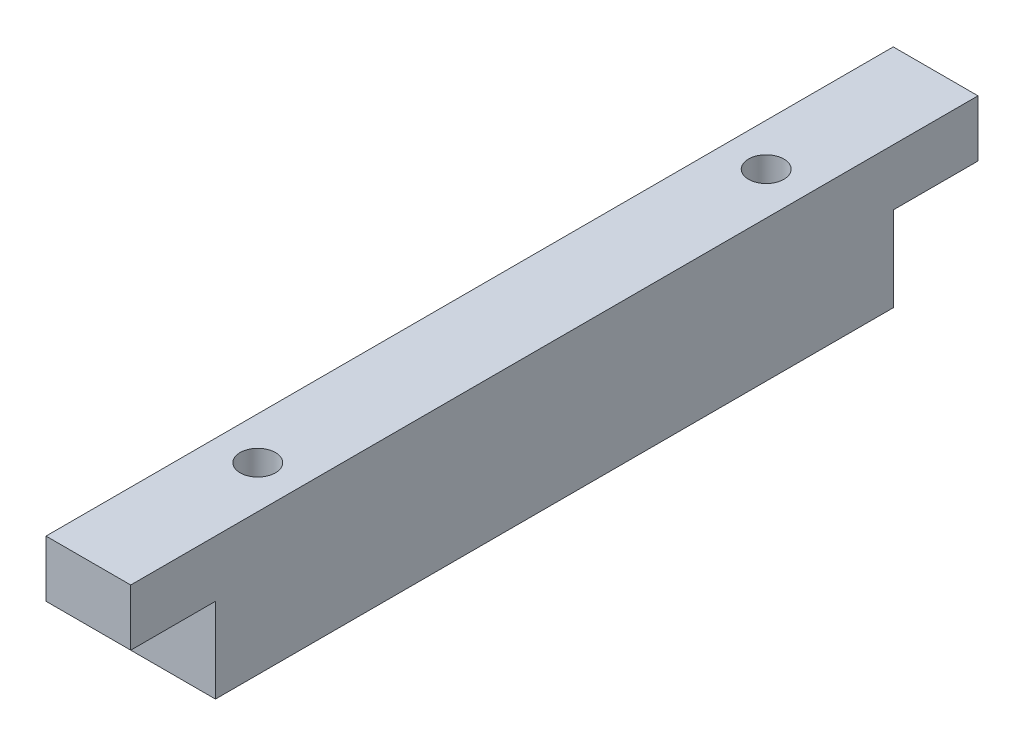
ISO-10303-21;
HEADER;
FILE_DESCRIPTION(('STEP AP214'),'2;1');
FILE_NAME('part.step','',(''),(''),'','','');
FILE_SCHEMA(('AUTOMOTIVE_DESIGN { 1 0 10303 214 1 1 1 1 }'));
ENDSEC;
DATA;
#1=APPLICATION_CONTEXT('core data for automotive mechanical design processes');
#2=APPLICATION_PROTOCOL_DEFINITION('international standard','automotive_design',2000,#1);
#3=PRODUCT_CONTEXT('',#1,'mechanical');
#4=PRODUCT('Part','Part','',(#3));
#5=PRODUCT_RELATED_PRODUCT_CATEGORY('part','',(#4));
#6=PRODUCT_DEFINITION_FORMATION('','',#4);
#7=PRODUCT_DEFINITION_CONTEXT('part definition',#1,'design');
#8=PRODUCT_DEFINITION('design','',#6,#7);
#9=PRODUCT_DEFINITION_SHAPE('','',#8);
#10=(LENGTH_UNIT() NAMED_UNIT(*) SI_UNIT(.MILLI.,.METRE.));
#11=(NAMED_UNIT(*) PLANE_ANGLE_UNIT() SI_UNIT($,.RADIAN.));
#12=(NAMED_UNIT(*) SI_UNIT($,.STERADIAN.) SOLID_ANGLE_UNIT());
#13=UNCERTAINTY_MEASURE_WITH_UNIT(LENGTH_MEASURE(1.E-05),#10,'distance_accuracy_value','');
#14=(GEOMETRIC_REPRESENTATION_CONTEXT(3) GLOBAL_UNCERTAINTY_ASSIGNED_CONTEXT((#13)) GLOBAL_UNIT_ASSIGNED_CONTEXT((#10,
#11,#12)) REPRESENTATION_CONTEXT('',''));
#15=CARTESIAN_POINT('',(0.,0.,0.));
#16=DIRECTION('',(0.,0.,1.));
#17=DIRECTION('',(1.,0.,0.));
#18=AXIS2_PLACEMENT_3D('',#15,#16,#17);
#19=CARTESIAN_POINT('',(6.,5.99999999999999,-6.));
#20=DIRECTION('',(0.,1.,0.));
#21=DIRECTION('',(0.,0.,1.));
#22=AXIS2_PLACEMENT_3D('',#19,#20,#21);
#23=PLANE('',#22);
#24=DIRECTION('',(0.,0.,-1.));
#25=VECTOR('',#24,1.);
#26=CARTESIAN_POINT('',(0.,5.99999999999999,-6.));
#27=LINE('',#26,#25);
#28=CARTESIAN_POINT('',(0.,5.99999999999999,0.));
#29=VERTEX_POINT('',#28);
#30=CARTESIAN_POINT('',(0.,5.99999999999999,-6.));
#31=VERTEX_POINT('',#30);
#32=EDGE_CURVE('E129',#29,#31,#27,.T.);
#33=ORIENTED_EDGE('',*,*,#32,.T.);
#34=DIRECTION('',(-1.,0.,0.));
#35=VECTOR('',#34,1.);
#36=CARTESIAN_POINT('',(6.,5.99999999999999,-6.));
#37=LINE('',#36,#35);
#38=CARTESIAN_POINT('',(6.,5.99999999999999,-6.));
#39=VERTEX_POINT('',#38);
#40=EDGE_CURVE('E11',#39,#31,#37,.T.);
#41=ORIENTED_EDGE('',*,*,#40,.F.);
#42=DIRECTION('',(0.,0.,-1.));
#43=VECTOR('',#42,1.);
#44=CARTESIAN_POINT('',(6.,5.99999999999999,-6.));
#45=LINE('',#44,#43);
#46=CARTESIAN_POINT('',(6.,5.99999999999999,0.));
#47=VERTEX_POINT('',#46);
#48=EDGE_CURVE('E144',#47,#39,#45,.T.);
#49=ORIENTED_EDGE('',*,*,#48,.F.);
#50=DIRECTION('',(-1.,0.,0.));
#51=VECTOR('',#50,1.);
#52=CARTESIAN_POINT('',(6.,5.99999999999999,0.));
#53=LINE('',#52,#51);
#54=EDGE_CURVE('E125',#47,#29,#53,.T.);
#55=ORIENTED_EDGE('',*,*,#54,.T.);
#56=EDGE_LOOP('',(#33,#41,#49,#55));
#57=FACE_BOUND('',#56,.T.);
#58=ADVANCED_FACE('F33',(#57),#23,.F.);
#59=CARTESIAN_POINT('',(6.,0.,-6.));
#60=DIRECTION('',(0.,0.,-1.));
#61=DIRECTION('',(-1.,0.,0.));
#62=AXIS2_PLACEMENT_3D('',#59,#60,#61);
#63=PLANE('',#62);
#64=DIRECTION('',(0.,-1.,0.));
#65=VECTOR('',#64,1.);
#66=CARTESIAN_POINT('',(0.,0.,-6.));
#67=LINE('',#66,#65);
#68=CARTESIAN_POINT('',(0.,0.,-6.));
#69=VERTEX_POINT('',#68);
#70=EDGE_CURVE('E132',#31,#69,#67,.T.);
#71=ORIENTED_EDGE('',*,*,#70,.T.);
#72=DIRECTION('',(-1.,0.,0.));
#73=VECTOR('',#72,1.);
#74=CARTESIAN_POINT('',(6.,0.,-6.));
#75=LINE('',#74,#73);
#76=CARTESIAN_POINT('',(6.,0.,-6.));
#77=VERTEX_POINT('',#76);
#78=EDGE_CURVE('E41',#77,#69,#75,.T.);
#79=ORIENTED_EDGE('',*,*,#78,.F.);
#80=DIRECTION('',(0.,-1.,0.));
#81=VECTOR('',#80,1.);
#82=CARTESIAN_POINT('',(6.,0.,-6.));
#83=LINE('',#82,#81);
#84=EDGE_CURVE('E92',#39,#77,#83,.T.);
#85=ORIENTED_EDGE('',*,*,#84,.F.);
#86=ORIENTED_EDGE('',*,*,#40,.T.);
#87=EDGE_LOOP('',(#71,#79,#85,#86));
#88=FACE_BOUND('',#87,.T.);
#89=ADVANCED_FACE('F193',(#88),#63,.F.);
#90=CARTESIAN_POINT('',(6.,0.,-54.));
#91=DIRECTION('',(0.,1.,0.));
#92=DIRECTION('',(0.,0.,1.));
#93=AXIS2_PLACEMENT_3D('',#90,#91,#92);
#94=PLANE('',#93);
#95=CARTESIAN_POINT('',(3.,0.,-12.));
#96=DIRECTION('',(0.,-1.,0.));
#97=DIRECTION('',(0.,0.,-1.));
#98=AXIS2_PLACEMENT_3D('',#95,#96,#97);
#99=CIRCLE('',#98,1.24999999999999);
#100=CARTESIAN_POINT('',(3.,0.,-13.25));
#101=VERTEX_POINT('',#100);
#102=EDGE_CURVE('E185',#101,#101,#99,.T.);
#103=ORIENTED_EDGE('',*,*,#102,.F.);
#104=EDGE_LOOP('',(#103));
#105=FACE_BOUND('',#104,.T.);
#106=CARTESIAN_POINT('',(3.,0.,-48.));
#107=DIRECTION('',(0.,-1.,0.));
#108=DIRECTION('',(0.,0.,-1.));
#109=AXIS2_PLACEMENT_3D('',#106,#107,#108);
#110=CIRCLE('',#109,1.24999999999999);
#111=CARTESIAN_POINT('',(3.,0.,-49.25));
#112=VERTEX_POINT('',#111);
#113=EDGE_CURVE('E179',#112,#112,#110,.T.);
#114=ORIENTED_EDGE('',*,*,#113,.F.);
#115=EDGE_LOOP('',(#114));
#116=FACE_BOUND('',#115,.T.);
#117=DIRECTION('',(0.,0.,-1.));
#118=VECTOR('',#117,1.);
#119=CARTESIAN_POINT('',(0.,0.,-54.));
#120=LINE('',#119,#118);
#121=CARTESIAN_POINT('',(0.,0.,-54.));
#122=VERTEX_POINT('',#121);
#123=EDGE_CURVE('E135',#69,#122,#120,.T.);
#124=ORIENTED_EDGE('',*,*,#123,.T.);
#125=DIRECTION('',(-1.,0.,0.));
#126=VECTOR('',#125,1.);
#127=CARTESIAN_POINT('',(6.,0.,-54.));
#128=LINE('',#127,#126);
#129=CARTESIAN_POINT('',(6.,0.,-54.));
#130=VERTEX_POINT('',#129);
#131=EDGE_CURVE('E151',#130,#122,#128,.T.);
#132=ORIENTED_EDGE('',*,*,#131,.F.);
#133=DIRECTION('',(0.,0.,-1.));
#134=VECTOR('',#133,1.);
#135=CARTESIAN_POINT('',(6.,0.,-54.));
#136=LINE('',#135,#134);
#137=EDGE_CURVE('E159',#77,#130,#136,.T.);
#138=ORIENTED_EDGE('',*,*,#137,.F.);
#139=ORIENTED_EDGE('',*,*,#78,.T.);
#140=EDGE_LOOP('',(#124,#132,#138,#139));
#141=FACE_BOUND('',#140,.T.);
#142=ADVANCED_FACE('F157',(#105,#116,#141),#94,.F.);
#143=CARTESIAN_POINT('',(6.,6.,-54.));
#144=DIRECTION('',(0.,0.,1.));
#145=DIRECTION('',(1.,0.,0.));
#146=AXIS2_PLACEMENT_3D('',#143,#144,#145);
#147=PLANE('',#146);
#148=DIRECTION('',(0.,1.,0.));
#149=VECTOR('',#148,1.);
#150=CARTESIAN_POINT('',(0.,6.,-54.));
#151=LINE('',#150,#149);
#152=CARTESIAN_POINT('',(0.,6.,-54.));
#153=VERTEX_POINT('',#152);
#154=EDGE_CURVE('E137',#122,#153,#151,.T.);
#155=ORIENTED_EDGE('',*,*,#154,.T.);
#156=DIRECTION('',(-1.,0.,0.));
#157=VECTOR('',#156,1.);
#158=CARTESIAN_POINT('',(6.,6.,-54.));
#159=LINE('',#158,#157);
#160=CARTESIAN_POINT('',(6.,6.,-54.));
#161=VERTEX_POINT('',#160);
#162=EDGE_CURVE('E148',#161,#153,#159,.T.);
#163=ORIENTED_EDGE('',*,*,#162,.F.);
#164=DIRECTION('',(0.,1.,0.));
#165=VECTOR('',#164,1.);
#166=CARTESIAN_POINT('',(6.,6.,-54.));
#167=LINE('',#166,#165);
#168=EDGE_CURVE('E171',#130,#161,#167,.T.);
#169=ORIENTED_EDGE('',*,*,#168,.F.);
#170=ORIENTED_EDGE('',*,*,#131,.T.);
#171=EDGE_LOOP('',(#155,#163,#169,#170));
#172=FACE_BOUND('',#171,.T.);
#173=ADVANCED_FACE('F167',(#172),#147,.F.);
#174=CARTESIAN_POINT('',(6.,6.,-60.));
#175=DIRECTION('',(0.,1.,0.));
#176=DIRECTION('',(0.,0.,1.));
#177=AXIS2_PLACEMENT_3D('',#174,#175,#176);
#178=PLANE('',#177);
#179=DIRECTION('',(0.,0.,-1.));
#180=VECTOR('',#179,1.);
#181=CARTESIAN_POINT('',(0.,6.,-60.));
#182=LINE('',#181,#180);
#183=CARTESIAN_POINT('',(0.,6.,-60.));
#184=VERTEX_POINT('',#183);
#185=EDGE_CURVE('E139',#153,#184,#182,.T.);
#186=ORIENTED_EDGE('',*,*,#185,.T.);
#187=DIRECTION('',(-1.,0.,0.));
#188=VECTOR('',#187,1.);
#189=CARTESIAN_POINT('',(6.,6.,-60.));
#190=LINE('',#189,#188);
#191=CARTESIAN_POINT('',(6.,6.,-60.));
#192=VERTEX_POINT('',#191);
#193=EDGE_CURVE('E120',#192,#184,#190,.T.);
#194=ORIENTED_EDGE('',*,*,#193,.F.);
#195=DIRECTION('',(0.,0.,-1.));
#196=VECTOR('',#195,1.);
#197=CARTESIAN_POINT('',(6.,6.,-60.));
#198=LINE('',#197,#196);
#199=EDGE_CURVE('E111',#161,#192,#198,.T.);
#200=ORIENTED_EDGE('',*,*,#199,.F.);
#201=ORIENTED_EDGE('',*,*,#162,.T.);
#202=EDGE_LOOP('',(#186,#194,#200,#201));
#203=FACE_BOUND('',#202,.T.);
#204=ADVANCED_FACE('F170',(#203),#178,.F.);
#205=CARTESIAN_POINT('',(6.,9.99999999999999,-60.));
#206=DIRECTION('',(0.,0.,1.));
#207=DIRECTION('',(1.,0.,0.));
#208=AXIS2_PLACEMENT_3D('',#205,#206,#207);
#209=PLANE('',#208);
#210=DIRECTION('',(0.,1.,0.));
#211=VECTOR('',#210,1.);
#212=CARTESIAN_POINT('',(0.,9.99999999999999,-60.));
#213=LINE('',#212,#211);
#214=CARTESIAN_POINT('',(0.,9.99999999999999,-60.));
#215=VERTEX_POINT('',#214);
#216=EDGE_CURVE('E119',#184,#215,#213,.T.);
#217=ORIENTED_EDGE('',*,*,#216,.T.);
#218=DIRECTION('',(-1.,0.,0.));
#219=VECTOR('',#218,1.);
#220=CARTESIAN_POINT('',(6.,9.99999999999999,-60.));
#221=LINE('',#220,#219);
#222=CARTESIAN_POINT('',(6.,9.99999999999999,-60.));
#223=VERTEX_POINT('',#222);
#224=EDGE_CURVE('E116',#223,#215,#221,.T.);
#225=ORIENTED_EDGE('',*,*,#224,.F.);
#226=DIRECTION('',(0.,1.,0.));
#227=VECTOR('',#226,1.);
#228=CARTESIAN_POINT('',(6.,9.99999999999999,-60.));
#229=LINE('',#228,#227);
#230=EDGE_CURVE('E105',#192,#223,#229,.T.);
#231=ORIENTED_EDGE('',*,*,#230,.F.);
#232=ORIENTED_EDGE('',*,*,#193,.T.);
#233=EDGE_LOOP('',(#217,#225,#231,#232));
#234=FACE_BOUND('',#233,.T.);
#235=ADVANCED_FACE('F117',(#234),#209,.F.);
#236=CARTESIAN_POINT('',(6.,9.99999999999999,0.));
#237=DIRECTION('',(0.,-1.,0.));
#238=DIRECTION('',(0.,0.,-1.));
#239=AXIS2_PLACEMENT_3D('',#236,#237,#238);
#240=PLANE('',#239);
#241=CARTESIAN_POINT('',(3.,9.99999999999999,-12.));
#242=DIRECTION('',(0.,-1.,0.));
#243=DIRECTION('',(0.,0.,-1.));
#244=AXIS2_PLACEMENT_3D('',#241,#242,#243);
#245=CIRCLE('',#244,1.24999999999999);
#246=CARTESIAN_POINT('',(3.,9.99999999999999,-13.25));
#247=VERTEX_POINT('',#246);
#248=EDGE_CURVE('E182',#247,#247,#245,.T.);
#249=ORIENTED_EDGE('',*,*,#248,.T.);
#250=EDGE_LOOP('',(#249));
#251=FACE_BOUND('',#250,.T.);
#252=CARTESIAN_POINT('',(3.,9.99999999999999,-48.));
#253=DIRECTION('',(0.,-1.,0.));
#254=DIRECTION('',(0.,0.,-1.));
#255=AXIS2_PLACEMENT_3D('',#252,#253,#254);
#256=CIRCLE('',#255,1.24999999999999);
#257=CARTESIAN_POINT('',(3.,9.99999999999999,-49.25));
#258=VERTEX_POINT('',#257);
#259=EDGE_CURVE('E133',#258,#258,#256,.T.);
#260=ORIENTED_EDGE('',*,*,#259,.T.);
#261=EDGE_LOOP('',(#260));
#262=FACE_BOUND('',#261,.T.);
#263=DIRECTION('',(0.,0.,1.));
#264=VECTOR('',#263,1.);
#265=CARTESIAN_POINT('',(0.,9.99999999999999,0.));
#266=LINE('',#265,#264);
#267=CARTESIAN_POINT('',(0.,9.99999999999999,0.));
#268=VERTEX_POINT('',#267);
#269=EDGE_CURVE('E78',#215,#268,#266,.T.);
#270=ORIENTED_EDGE('',*,*,#269,.T.);
#271=DIRECTION('',(-1.,0.,0.));
#272=VECTOR('',#271,1.);
#273=CARTESIAN_POINT('',(6.,9.99999999999999,0.));
#274=LINE('',#273,#272);
#275=CARTESIAN_POINT('',(6.,9.99999999999999,0.));
#276=VERTEX_POINT('',#275);
#277=EDGE_CURVE('E121',#276,#268,#274,.T.);
#278=ORIENTED_EDGE('',*,*,#277,.F.);
#279=DIRECTION('',(0.,0.,1.));
#280=VECTOR('',#279,1.);
#281=CARTESIAN_POINT('',(6.,9.99999999999999,0.));
#282=LINE('',#281,#280);
#283=EDGE_CURVE('E109',#223,#276,#282,.T.);
#284=ORIENTED_EDGE('',*,*,#283,.F.);
#285=ORIENTED_EDGE('',*,*,#224,.T.);
#286=EDGE_LOOP('',(#270,#278,#284,#285));
#287=FACE_BOUND('',#286,.T.);
#288=ADVANCED_FACE('F123',(#251,#262,#287),#240,.F.);
#289=CARTESIAN_POINT('',(6.,5.99999999999999,0.));
#290=DIRECTION('',(0.,0.,-1.));
#291=DIRECTION('',(-1.,0.,0.));
#292=AXIS2_PLACEMENT_3D('',#289,#290,#291);
#293=PLANE('',#292);
#294=DIRECTION('',(0.,-1.,0.));
#295=VECTOR('',#294,1.);
#296=CARTESIAN_POINT('',(0.,5.99999999999999,0.));
#297=LINE('',#296,#295);
#298=EDGE_CURVE('E84',#268,#29,#297,.T.);
#299=ORIENTED_EDGE('',*,*,#298,.T.);
#300=ORIENTED_EDGE('',*,*,#54,.F.);
#301=DIRECTION('',(0.,-1.,0.));
#302=VECTOR('',#301,1.);
#303=CARTESIAN_POINT('',(6.,5.99999999999999,0.));
#304=LINE('',#303,#302);
#305=EDGE_CURVE('E49',#276,#47,#304,.T.);
#306=ORIENTED_EDGE('',*,*,#305,.F.);
#307=ORIENTED_EDGE('',*,*,#277,.T.);
#308=EDGE_LOOP('',(#299,#300,#306,#307));
#309=FACE_BOUND('',#308,.T.);
#310=ADVANCED_FACE('F217',(#309),#293,.F.);
#311=CARTESIAN_POINT('',(6.,0.,0.));
#312=DIRECTION('',(-1.,0.,0.));
#313=DIRECTION('',(0.,0.,1.));
#314=AXIS2_PLACEMENT_3D('',#311,#312,#313);
#315=PLANE('',#314);
#316=ORIENTED_EDGE('',*,*,#48,.T.);
#317=ORIENTED_EDGE('',*,*,#84,.T.);
#318=ORIENTED_EDGE('',*,*,#137,.T.);
#319=ORIENTED_EDGE('',*,*,#168,.T.);
#320=ORIENTED_EDGE('',*,*,#199,.T.);
#321=ORIENTED_EDGE('',*,*,#230,.T.);
#322=ORIENTED_EDGE('',*,*,#283,.T.);
#323=ORIENTED_EDGE('',*,*,#305,.T.);
#324=EDGE_LOOP('',(#316,#317,#318,#319,#320,#321,#322,#323));
#325=FACE_BOUND('',#324,.T.);
#326=ADVANCED_FACE('F107',(#325),#315,.F.);
#327=CARTESIAN_POINT('',(0.,0.,0.));
#328=DIRECTION('',(-1.,0.,0.));
#329=DIRECTION('',(0.,0.,1.));
#330=AXIS2_PLACEMENT_3D('',#327,#328,#329);
#331=PLANE('',#330);
#332=ORIENTED_EDGE('',*,*,#32,.F.);
#333=ORIENTED_EDGE('',*,*,#298,.F.);
#334=ORIENTED_EDGE('',*,*,#269,.F.);
#335=ORIENTED_EDGE('',*,*,#216,.F.);
#336=ORIENTED_EDGE('',*,*,#185,.F.);
#337=ORIENTED_EDGE('',*,*,#154,.F.);
#338=ORIENTED_EDGE('',*,*,#123,.F.);
#339=ORIENTED_EDGE('',*,*,#70,.F.);
#340=EDGE_LOOP('',(#332,#333,#334,#335,#336,#337,#338,#339));
#341=FACE_BOUND('',#340,.T.);
#342=ADVANCED_FACE('F163',(#341),#331,.T.);
#343=CARTESIAN_POINT('',(3.,0.,-48.));
#344=DIRECTION('',(0.,-1.,0.));
#345=DIRECTION('',(0.,0.,-1.));
#346=AXIS2_PLACEMENT_3D('',#343,#344,#345);
#347=CYLINDRICAL_SURFACE('',#346,1.24999999999999);
#348=ORIENTED_EDGE('',*,*,#259,.F.);
#349=EDGE_LOOP('',(#348));
#350=FACE_BOUND('',#349,.T.);
#351=ORIENTED_EDGE('',*,*,#113,.T.);
#352=EDGE_LOOP('',(#351));
#353=FACE_BOUND('',#352,.T.);
#354=ADVANCED_FACE('F197',(#350,#353),#347,.F.);
#355=CARTESIAN_POINT('',(3.,0.,-12.));
#356=DIRECTION('',(0.,-1.,0.));
#357=DIRECTION('',(0.,0.,-1.));
#358=AXIS2_PLACEMENT_3D('',#355,#356,#357);
#359=CYLINDRICAL_SURFACE('',#358,1.24999999999999);
#360=ORIENTED_EDGE('',*,*,#248,.F.);
#361=EDGE_LOOP('',(#360));
#362=FACE_BOUND('',#361,.T.);
#363=ORIENTED_EDGE('',*,*,#102,.T.);
#364=EDGE_LOOP('',(#363));
#365=FACE_BOUND('',#364,.T.);
#366=ADVANCED_FACE('F189',(#362,#365),#359,.F.);
#367=CLOSED_SHELL('',(#58,#89,#142,#173,#204,#235,#288,#310,#326,#342,#354,#366));
#368=MANIFOLD_SOLID_BREP('B2',#367);
#369=ADVANCED_BREP_SHAPE_REPRESENTATION('',(#18,#368),#14);
#370=SHAPE_DEFINITION_REPRESENTATION(#9,#369);
ENDSEC;
END-ISO-10303-21;
